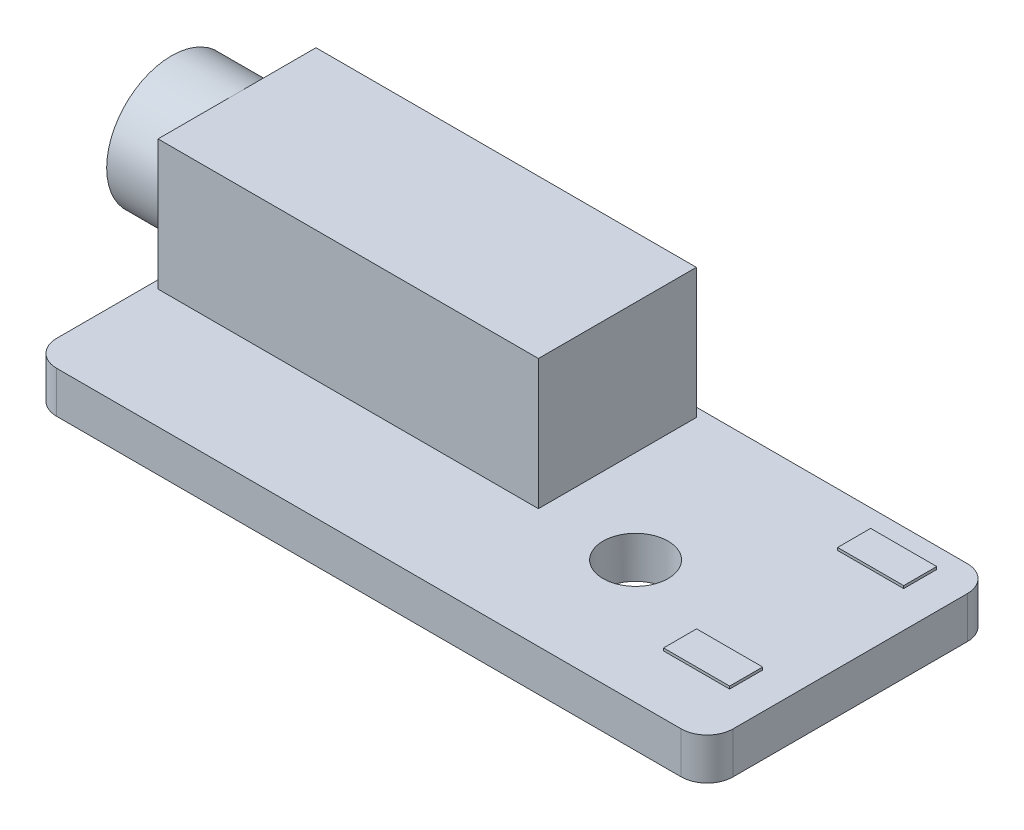
ISO-10303-21;
HEADER;
FILE_DESCRIPTION(('STEP AP214'),'2;1');
FILE_NAME('part.step','',(''),(''),'','','');
FILE_SCHEMA(('AUTOMOTIVE_DESIGN { 1 0 10303 214 1 1 1 1 }'));
ENDSEC;
DATA;
#1=APPLICATION_CONTEXT('core data for automotive mechanical design processes');
#2=APPLICATION_PROTOCOL_DEFINITION('international standard','automotive_design',2000,#1);
#3=PRODUCT_CONTEXT('',#1,'mechanical');
#4=PRODUCT('Part','Part','',(#3));
#5=PRODUCT_RELATED_PRODUCT_CATEGORY('part','',(#4));
#6=PRODUCT_DEFINITION_FORMATION('','',#4);
#7=PRODUCT_DEFINITION_CONTEXT('part definition',#1,'design');
#8=PRODUCT_DEFINITION('design','',#6,#7);
#9=PRODUCT_DEFINITION_SHAPE('','',#8);
#10=(LENGTH_UNIT() NAMED_UNIT(*) SI_UNIT(.MILLI.,.METRE.));
#11=(NAMED_UNIT(*) PLANE_ANGLE_UNIT() SI_UNIT($,.RADIAN.));
#12=(NAMED_UNIT(*) SI_UNIT($,.STERADIAN.) SOLID_ANGLE_UNIT());
#13=UNCERTAINTY_MEASURE_WITH_UNIT(LENGTH_MEASURE(1.E-05),#10,'distance_accuracy_value','');
#14=(GEOMETRIC_REPRESENTATION_CONTEXT(3) GLOBAL_UNCERTAINTY_ASSIGNED_CONTEXT((#13)) GLOBAL_UNIT_ASSIGNED_CONTEXT((#10,
#11,#12)) REPRESENTATION_CONTEXT('',''));
#15=CARTESIAN_POINT('',(0.,0.,0.));
#16=DIRECTION('',(0.,0.,1.));
#17=DIRECTION('',(1.,0.,0.));
#18=AXIS2_PLACEMENT_3D('',#15,#16,#17);
#19=CARTESIAN_POINT('',(12.,1.6,-4.5));
#20=DIRECTION('',(0.,-1.,0.));
#21=DIRECTION('',(0.,0.,-1.));
#22=AXIS2_PLACEMENT_3D('',#19,#20,#21);
#23=PLANE('',#22);
#24=CARTESIAN_POINT('',(5.5,1.6,0.750000000000002));
#25=DIRECTION('',(0.,-1.,0.));
#26=DIRECTION('',(0.,0.,-1.));
#27=AXIS2_PLACEMENT_3D('',#24,#25,#26);
#28=CIRCLE('',#27,1.25);
#29=CARTESIAN_POINT('',(5.5,1.6,-0.499999999999999));
#30=VERTEX_POINT('',#29);
#31=EDGE_CURVE('E696',#30,#30,#28,.T.);
#32=ORIENTED_EDGE('',*,*,#31,.T.);
#33=EDGE_LOOP('',(#32));
#34=FACE_BOUND('',#33,.T.);
#35=DIRECTION('',(0.,0.,-1.));
#36=VECTOR('',#35,1.);
#37=CARTESIAN_POINT('',(11.61,1.6,1.975));
#38=LINE('',#37,#36);
#39=CARTESIAN_POINT('',(11.61,1.6,3.245));
#40=VERTEX_POINT('',#39);
#41=CARTESIAN_POINT('',(11.61,1.6,1.975));
#42=VERTEX_POINT('',#41);
#43=EDGE_CURVE('E200',#40,#42,#38,.T.);
#44=ORIENTED_EDGE('',*,*,#43,.F.);
#45=DIRECTION('',(1.,0.,0.));
#46=VECTOR('',#45,1.);
#47=CARTESIAN_POINT('',(9.07,1.6,3.245));
#48=LINE('',#47,#46);
#49=CARTESIAN_POINT('',(9.07,1.6,3.245));
#50=VERTEX_POINT('',#49);
#51=EDGE_CURVE('E216',#50,#40,#48,.T.);
#52=ORIENTED_EDGE('',*,*,#51,.F.);
#53=DIRECTION('',(0.,0.,1.));
#54=VECTOR('',#53,1.);
#55=CARTESIAN_POINT('',(9.07,1.6,1.975));
#56=LINE('',#55,#54);
#57=CARTESIAN_POINT('',(9.07,1.6,1.975));
#58=VERTEX_POINT('',#57);
#59=EDGE_CURVE('E229',#58,#50,#56,.T.);
#60=ORIENTED_EDGE('',*,*,#59,.F.);
#61=DIRECTION('',(-1.,0.,0.));
#62=VECTOR('',#61,1.);
#63=CARTESIAN_POINT('',(9.07,1.6,1.975));
#64=LINE('',#63,#62);
#65=EDGE_CURVE('E205',#42,#58,#64,.T.);
#66=ORIENTED_EDGE('',*,*,#65,.F.);
#67=EDGE_LOOP('',(#44,#52,#60,#66));
#68=FACE_BOUND('',#67,.T.);
#69=CARTESIAN_POINT('',(12.,1.6,-4.5));
#70=DIRECTION('',(0.,1.,0.));
#71=DIRECTION('',(0.,0.,-1.));
#72=AXIS2_PLACEMENT_3D('',#69,#70,#71);
#73=CIRCLE('',#72,1.);
#74=CARTESIAN_POINT('',(13.,1.6,-4.49999999999999));
#75=VERTEX_POINT('',#74);
#76=CARTESIAN_POINT('',(12.,1.6,-5.5));
#77=VERTEX_POINT('',#76);
#78=EDGE_CURVE('E297',#75,#77,#73,.T.);
#79=ORIENTED_EDGE('',*,*,#78,.T.);
#80=DIRECTION('',(-1.,0.,0.));
#81=VECTOR('',#80,1.);
#82=CARTESIAN_POINT('',(12.,1.6,-5.5));
#83=LINE('',#82,#81);
#84=CARTESIAN_POINT('',(-12.,1.6,-5.5));
#85=VERTEX_POINT('',#84);
#86=EDGE_CURVE('E301',#77,#85,#83,.T.);
#87=ORIENTED_EDGE('',*,*,#86,.T.);
#88=CARTESIAN_POINT('',(-12.,1.6,-4.5));
#89=DIRECTION('',(0.,1.,0.));
#90=DIRECTION('',(0.,0.,1.));
#91=AXIS2_PLACEMENT_3D('',#88,#89,#90);
#92=CIRCLE('',#91,1.);
#93=CARTESIAN_POINT('',(-13.,1.6,-4.49999999999999));
#94=VERTEX_POINT('',#93);
#95=EDGE_CURVE('E305',#85,#94,#92,.T.);
#96=ORIENTED_EDGE('',*,*,#95,.T.);
#97=DIRECTION('',(0.,0.,1.));
#98=VECTOR('',#97,1.);
#99=CARTESIAN_POINT('',(-13.,1.6,-4.49999999999999));
#100=LINE('',#99,#98);
#101=CARTESIAN_POINT('',(-13.,1.6,4.49999999999999));
#102=VERTEX_POINT('',#101);
#103=EDGE_CURVE('E308',#94,#102,#100,.T.);
#104=ORIENTED_EDGE('',*,*,#103,.T.);
#105=CARTESIAN_POINT('',(-12.,1.6,4.5));
#106=DIRECTION('',(0.,1.,0.));
#107=DIRECTION('',(0.,0.,-1.));
#108=AXIS2_PLACEMENT_3D('',#105,#106,#107);
#109=CIRCLE('',#108,1.);
#110=CARTESIAN_POINT('',(-12.,1.6,5.5));
#111=VERTEX_POINT('',#110);
#112=EDGE_CURVE('E311',#102,#111,#109,.T.);
#113=ORIENTED_EDGE('',*,*,#112,.T.);
#114=DIRECTION('',(1.,0.,0.));
#115=VECTOR('',#114,1.);
#116=CARTESIAN_POINT('',(12.,1.6,5.5));
#117=LINE('',#116,#115);
#118=CARTESIAN_POINT('',(12.,1.6,5.5));
#119=VERTEX_POINT('',#118);
#120=EDGE_CURVE('E314',#111,#119,#117,.T.);
#121=ORIENTED_EDGE('',*,*,#120,.T.);
#122=CARTESIAN_POINT('',(12.,1.6,4.5));
#123=DIRECTION('',(0.,1.,0.));
#124=DIRECTION('',(0.,0.,-1.));
#125=AXIS2_PLACEMENT_3D('',#122,#123,#124);
#126=CIRCLE('',#125,1.);
#127=CARTESIAN_POINT('',(13.,1.6,4.49999999999999));
#128=VERTEX_POINT('',#127);
#129=EDGE_CURVE('E317',#119,#128,#126,.T.);
#130=ORIENTED_EDGE('',*,*,#129,.T.);
#131=DIRECTION('',(0.,0.,-1.));
#132=VECTOR('',#131,1.);
#133=CARTESIAN_POINT('',(13.,1.6,-4.49999999999999));
#134=LINE('',#133,#132);
#135=EDGE_CURVE('E320',#128,#75,#134,.T.);
#136=ORIENTED_EDGE('',*,*,#135,.T.);
#137=EDGE_LOOP('',(#79,#87,#96,#104,#113,#121,#130,#136));
#138=FACE_BOUND('',#137,.T.);
#139=DIRECTION('',(0.,0.,-1.));
#140=VECTOR('',#139,1.);
#141=CARTESIAN_POINT('',(11.61,1.6,-4.715));
#142=LINE('',#141,#140);
#143=CARTESIAN_POINT('',(11.61,1.6,-3.445));
#144=VERTEX_POINT('',#143);
#145=CARTESIAN_POINT('',(11.61,1.6,-4.715));
#146=VERTEX_POINT('',#145);
#147=EDGE_CURVE('E251',#144,#146,#142,.T.);
#148=ORIENTED_EDGE('',*,*,#147,.F.);
#149=DIRECTION('',(1.,0.,0.));
#150=VECTOR('',#149,1.);
#151=CARTESIAN_POINT('',(9.07,1.6,-3.445));
#152=LINE('',#151,#150);
#153=CARTESIAN_POINT('',(9.07,1.6,-3.445));
#154=VERTEX_POINT('',#153);
#155=EDGE_CURVE('E257',#154,#144,#152,.T.);
#156=ORIENTED_EDGE('',*,*,#155,.F.);
#157=DIRECTION('',(0.,0.,1.));
#158=VECTOR('',#157,1.);
#159=CARTESIAN_POINT('',(9.07,1.6,-4.715));
#160=LINE('',#159,#158);
#161=CARTESIAN_POINT('',(9.07,1.6,-4.715));
#162=VERTEX_POINT('',#161);
#163=EDGE_CURVE('E274',#162,#154,#160,.T.);
#164=ORIENTED_EDGE('',*,*,#163,.F.);
#165=DIRECTION('',(-1.,0.,0.));
#166=VECTOR('',#165,1.);
#167=CARTESIAN_POINT('',(9.07,1.6,-4.715));
#168=LINE('',#167,#166);
#169=EDGE_CURVE('E270',#146,#162,#168,.T.);
#170=ORIENTED_EDGE('',*,*,#169,.F.);
#171=EDGE_LOOP('',(#148,#156,#164,#170));
#172=FACE_BOUND('',#171,.T.);
#173=DIRECTION('',(0.,0.,-1.));
#174=VECTOR('',#173,1.);
#175=CARTESIAN_POINT('',(1.93,1.6,-5.155));
#176=LINE('',#175,#174);
#177=CARTESIAN_POINT('',(1.93,1.6,0.915000000000001));
#178=VERTEX_POINT('',#177);
#179=CARTESIAN_POINT('',(1.93,1.6,-5.155));
#180=VERTEX_POINT('',#179);
#181=EDGE_CURVE('E198',#178,#180,#176,.T.);
#182=ORIENTED_EDGE('',*,*,#181,.F.);
#183=DIRECTION('',(1.,0.,0.));
#184=VECTOR('',#183,1.);
#185=CARTESIAN_POINT('',(-12.69,1.6,0.915000000000001));
#186=LINE('',#185,#184);
#187=CARTESIAN_POINT('',(-12.69,1.6,0.915000000000001));
#188=VERTEX_POINT('',#187);
#189=EDGE_CURVE('E195',#188,#178,#186,.T.);
#190=ORIENTED_EDGE('',*,*,#189,.F.);
#191=DIRECTION('',(0.,0.,1.));
#192=VECTOR('',#191,1.);
#193=CARTESIAN_POINT('',(-12.69,1.6,-5.155));
#194=LINE('',#193,#192);
#195=CARTESIAN_POINT('',(-12.69,1.6,-5.155));
#196=VERTEX_POINT('',#195);
#197=EDGE_CURVE('E59',#196,#188,#194,.T.);
#198=ORIENTED_EDGE('',*,*,#197,.F.);
#199=DIRECTION('',(-1.,0.,0.));
#200=VECTOR('',#199,1.);
#201=CARTESIAN_POINT('',(-12.69,1.6,-5.155));
#202=LINE('',#201,#200);
#203=EDGE_CURVE('E54',#180,#196,#202,.T.);
#204=ORIENTED_EDGE('',*,*,#203,.F.);
#205=EDGE_LOOP('',(#182,#190,#198,#204));
#206=FACE_BOUND('',#205,.T.);
#207=ADVANCED_FACE('F38',(#34,#68,#138,#172,#206),#23,.F.);
#208=CARTESIAN_POINT('',(12.,1.6,-4.5));
#209=DIRECTION('',(0.,-1.,0.));
#210=DIRECTION('',(0.,0.,-1.));
#211=AXIS2_PLACEMENT_3D('',#208,#209,#210);
#212=CYLINDRICAL_SURFACE('',#211,1.);
#213=CARTESIAN_POINT('',(12.,0.,-4.5));
#214=DIRECTION('',(0.,1.,0.));
#215=DIRECTION('',(0.,0.,-1.));
#216=AXIS2_PLACEMENT_3D('',#213,#214,#215);
#217=CIRCLE('',#216,1.);
#218=CARTESIAN_POINT('',(13.,0.,-4.49999999999999));
#219=VERTEX_POINT('',#218);
#220=CARTESIAN_POINT('',(12.,0.,-5.5));
#221=VERTEX_POINT('',#220);
#222=EDGE_CURVE('E296',#219,#221,#217,.T.);
#223=ORIENTED_EDGE('',*,*,#222,.T.);
#224=DIRECTION('',(0.,-1.,0.));
#225=VECTOR('',#224,1.);
#226=CARTESIAN_POINT('',(12.,1.6,-5.5));
#227=LINE('',#226,#225);
#228=EDGE_CURVE('E47',#77,#221,#227,.T.);
#229=ORIENTED_EDGE('',*,*,#228,.F.);
#230=ORIENTED_EDGE('',*,*,#78,.F.);
#231=DIRECTION('',(0.,-1.,0.));
#232=VECTOR('',#231,1.);
#233=CARTESIAN_POINT('',(13.,1.6,-4.49999999999999));
#234=LINE('',#233,#232);
#235=EDGE_CURVE('E323',#75,#219,#234,.T.);
#236=ORIENTED_EDGE('',*,*,#235,.T.);
#237=EDGE_LOOP('',(#223,#229,#230,#236));
#238=FACE_BOUND('',#237,.T.);
#239=ADVANCED_FACE('F40',(#238),#212,.T.);
#240=CARTESIAN_POINT('',(12.,1.6,-5.5));
#241=DIRECTION('',(0.,0.,1.));
#242=DIRECTION('',(1.,0.,0.));
#243=AXIS2_PLACEMENT_3D('',#240,#241,#242);
#244=PLANE('',#243);
#245=DIRECTION('',(-1.,0.,0.));
#246=VECTOR('',#245,1.);
#247=CARTESIAN_POINT('',(12.,0.,-5.5));
#248=LINE('',#247,#246);
#249=CARTESIAN_POINT('',(-12.,0.,-5.5));
#250=VERTEX_POINT('',#249);
#251=EDGE_CURVE('E327',#221,#250,#248,.T.);
#252=ORIENTED_EDGE('',*,*,#251,.T.);
#253=DIRECTION('',(0.,-1.,0.));
#254=VECTOR('',#253,1.);
#255=CARTESIAN_POINT('',(-12.,1.6,-5.5));
#256=LINE('',#255,#254);
#257=EDGE_CURVE('E370',#85,#250,#256,.T.);
#258=ORIENTED_EDGE('',*,*,#257,.F.);
#259=ORIENTED_EDGE('',*,*,#86,.F.);
#260=ORIENTED_EDGE('',*,*,#228,.T.);
#261=EDGE_LOOP('',(#252,#258,#259,#260));
#262=FACE_BOUND('',#261,.T.);
#263=ADVANCED_FACE('F377',(#262),#244,.F.);
#264=CARTESIAN_POINT('',(-12.,1.6,-4.5));
#265=DIRECTION('',(0.,-1.,0.));
#266=DIRECTION('',(0.,0.,-1.));
#267=AXIS2_PLACEMENT_3D('',#264,#265,#266);
#268=CYLINDRICAL_SURFACE('',#267,1.);
#269=CARTESIAN_POINT('',(-12.,0.,-4.5));
#270=DIRECTION('',(0.,1.,0.));
#271=DIRECTION('',(0.,0.,1.));
#272=AXIS2_PLACEMENT_3D('',#269,#270,#271);
#273=CIRCLE('',#272,1.);
#274=CARTESIAN_POINT('',(-13.,0.,-4.49999999999999));
#275=VERTEX_POINT('',#274);
#276=EDGE_CURVE('E330',#250,#275,#273,.T.);
#277=ORIENTED_EDGE('',*,*,#276,.T.);
#278=DIRECTION('',(0.,-1.,0.));
#279=VECTOR('',#278,1.);
#280=CARTESIAN_POINT('',(-13.,1.6,-4.49999999999999));
#281=LINE('',#280,#279);
#282=EDGE_CURVE('E366',#94,#275,#281,.T.);
#283=ORIENTED_EDGE('',*,*,#282,.F.);
#284=ORIENTED_EDGE('',*,*,#95,.F.);
#285=ORIENTED_EDGE('',*,*,#257,.T.);
#286=EDGE_LOOP('',(#277,#283,#284,#285));
#287=FACE_BOUND('',#286,.T.);
#288=ADVANCED_FACE('F392',(#287),#268,.T.);
#289=CARTESIAN_POINT('',(-13.,1.6,-4.49999999999999));
#290=DIRECTION('',(1.,0.,0.));
#291=DIRECTION('',(0.,0.,-1.));
#292=AXIS2_PLACEMENT_3D('',#289,#290,#291);
#293=PLANE('',#292);
#294=DIRECTION('',(0.,0.,1.));
#295=VECTOR('',#294,1.);
#296=CARTESIAN_POINT('',(-13.,0.,-4.49999999999999));
#297=LINE('',#296,#295);
#298=CARTESIAN_POINT('',(-13.,0.,4.49999999999999));
#299=VERTEX_POINT('',#298);
#300=EDGE_CURVE('E333',#275,#299,#297,.T.);
#301=ORIENTED_EDGE('',*,*,#300,.T.);
#302=DIRECTION('',(0.,-1.,0.));
#303=VECTOR('',#302,1.);
#304=CARTESIAN_POINT('',(-13.,1.6,4.49999999999999));
#305=LINE('',#304,#303);
#306=EDGE_CURVE('E362',#102,#299,#305,.T.);
#307=ORIENTED_EDGE('',*,*,#306,.F.);
#308=ORIENTED_EDGE('',*,*,#103,.F.);
#309=ORIENTED_EDGE('',*,*,#282,.T.);
#310=EDGE_LOOP('',(#301,#307,#308,#309));
#311=FACE_BOUND('',#310,.T.);
#312=ADVANCED_FACE('F396',(#311),#293,.F.);
#313=CARTESIAN_POINT('',(-12.,1.6,4.5));
#314=DIRECTION('',(0.,-1.,0.));
#315=DIRECTION('',(0.,0.,-1.));
#316=AXIS2_PLACEMENT_3D('',#313,#314,#315);
#317=CYLINDRICAL_SURFACE('',#316,1.);
#318=CARTESIAN_POINT('',(-12.,0.,4.5));
#319=DIRECTION('',(0.,1.,0.));
#320=DIRECTION('',(0.,0.,-1.));
#321=AXIS2_PLACEMENT_3D('',#318,#319,#320);
#322=CIRCLE('',#321,1.);
#323=CARTESIAN_POINT('',(-12.,0.,5.5));
#324=VERTEX_POINT('',#323);
#325=EDGE_CURVE('E336',#299,#324,#322,.T.);
#326=ORIENTED_EDGE('',*,*,#325,.T.);
#327=DIRECTION('',(0.,-1.,0.));
#328=VECTOR('',#327,1.);
#329=CARTESIAN_POINT('',(-12.,1.6,5.5));
#330=LINE('',#329,#328);
#331=EDGE_CURVE('E358',#111,#324,#330,.T.);
#332=ORIENTED_EDGE('',*,*,#331,.F.);
#333=ORIENTED_EDGE('',*,*,#112,.F.);
#334=ORIENTED_EDGE('',*,*,#306,.T.);
#335=EDGE_LOOP('',(#326,#332,#333,#334));
#336=FACE_BOUND('',#335,.T.);
#337=ADVANCED_FACE('F415',(#336),#317,.T.);
#338=CARTESIAN_POINT('',(12.,1.6,5.5));
#339=DIRECTION('',(0.,0.,-1.));
#340=DIRECTION('',(-1.,0.,0.));
#341=AXIS2_PLACEMENT_3D('',#338,#339,#340);
#342=PLANE('',#341);
#343=DIRECTION('',(1.,0.,0.));
#344=VECTOR('',#343,1.);
#345=CARTESIAN_POINT('',(12.,0.,5.5));
#346=LINE('',#345,#344);
#347=CARTESIAN_POINT('',(12.,0.,5.5));
#348=VERTEX_POINT('',#347);
#349=EDGE_CURVE('E339',#324,#348,#346,.T.);
#350=ORIENTED_EDGE('',*,*,#349,.T.);
#351=DIRECTION('',(0.,-1.,0.));
#352=VECTOR('',#351,1.);
#353=CARTESIAN_POINT('',(12.,1.6,5.5));
#354=LINE('',#353,#352);
#355=EDGE_CURVE('E354',#119,#348,#354,.T.);
#356=ORIENTED_EDGE('',*,*,#355,.F.);
#357=ORIENTED_EDGE('',*,*,#120,.F.);
#358=ORIENTED_EDGE('',*,*,#331,.T.);
#359=EDGE_LOOP('',(#350,#356,#357,#358));
#360=FACE_BOUND('',#359,.T.);
#361=ADVANCED_FACE('F412',(#360),#342,.F.);
#362=CARTESIAN_POINT('',(12.,1.6,4.5));
#363=DIRECTION('',(0.,-1.,0.));
#364=DIRECTION('',(0.,0.,-1.));
#365=AXIS2_PLACEMENT_3D('',#362,#363,#364);
#366=CYLINDRICAL_SURFACE('',#365,1.);
#367=CARTESIAN_POINT('',(12.,0.,4.5));
#368=DIRECTION('',(0.,1.,0.));
#369=DIRECTION('',(0.,0.,-1.));
#370=AXIS2_PLACEMENT_3D('',#367,#368,#369);
#371=CIRCLE('',#370,1.);
#372=CARTESIAN_POINT('',(13.,0.,4.49999999999999));
#373=VERTEX_POINT('',#372);
#374=EDGE_CURVE('E342',#348,#373,#371,.T.);
#375=ORIENTED_EDGE('',*,*,#374,.T.);
#376=DIRECTION('',(0.,-1.,0.));
#377=VECTOR('',#376,1.);
#378=CARTESIAN_POINT('',(13.,1.6,4.49999999999999));
#379=LINE('',#378,#377);
#380=EDGE_CURVE('E350',#128,#373,#379,.T.);
#381=ORIENTED_EDGE('',*,*,#380,.F.);
#382=ORIENTED_EDGE('',*,*,#129,.F.);
#383=ORIENTED_EDGE('',*,*,#355,.T.);
#384=EDGE_LOOP('',(#375,#381,#382,#383));
#385=FACE_BOUND('',#384,.T.);
#386=ADVANCED_FACE('F408',(#385),#366,.T.);
#387=CARTESIAN_POINT('',(13.,1.6,-4.49999999999999));
#388=DIRECTION('',(-1.,0.,0.));
#389=DIRECTION('',(0.,0.,1.));
#390=AXIS2_PLACEMENT_3D('',#387,#388,#389);
#391=PLANE('',#390);
#392=DIRECTION('',(0.,0.,-1.));
#393=VECTOR('',#392,1.);
#394=CARTESIAN_POINT('',(13.,0.,-4.49999999999999));
#395=LINE('',#394,#393);
#396=EDGE_CURVE('E302',#373,#219,#395,.T.);
#397=ORIENTED_EDGE('',*,*,#396,.T.);
#398=ORIENTED_EDGE('',*,*,#235,.F.);
#399=ORIENTED_EDGE('',*,*,#135,.F.);
#400=ORIENTED_EDGE('',*,*,#380,.T.);
#401=EDGE_LOOP('',(#397,#398,#399,#400));
#402=FACE_BOUND('',#401,.T.);
#403=ADVANCED_FACE('F406',(#402),#391,.F.);
#404=CARTESIAN_POINT('',(12.,0.,-4.5));
#405=DIRECTION('',(0.,-1.,0.));
#406=DIRECTION('',(0.,0.,-1.));
#407=AXIS2_PLACEMENT_3D('',#404,#405,#406);
#408=PLANE('',#407);
#409=CARTESIAN_POINT('',(5.5,0.,0.750000000000002));
#410=DIRECTION('',(0.,1.,0.));
#411=DIRECTION('',(0.,0.,1.));
#412=AXIS2_PLACEMENT_3D('',#409,#410,#411);
#413=CIRCLE('',#412,1.25);
#414=CARTESIAN_POINT('',(5.5,0.,2.));
#415=VERTEX_POINT('',#414);
#416=EDGE_CURVE('E694',#415,#415,#413,.T.);
#417=ORIENTED_EDGE('',*,*,#416,.T.);
#418=EDGE_LOOP('',(#417));
#419=FACE_BOUND('',#418,.T.);
#420=ORIENTED_EDGE('',*,*,#222,.F.);
#421=ORIENTED_EDGE('',*,*,#396,.F.);
#422=ORIENTED_EDGE('',*,*,#374,.F.);
#423=ORIENTED_EDGE('',*,*,#349,.F.);
#424=ORIENTED_EDGE('',*,*,#325,.F.);
#425=ORIENTED_EDGE('',*,*,#300,.F.);
#426=ORIENTED_EDGE('',*,*,#276,.F.);
#427=ORIENTED_EDGE('',*,*,#251,.F.);
#428=EDGE_LOOP('',(#420,#421,#422,#423,#424,#425,#426,#427));
#429=FACE_BOUND('',#428,.T.);
#430=ADVANCED_FACE('F385',(#419,#429),#408,.T.);
#431=CARTESIAN_POINT('',(11.61,1.7,-4.715));
#432=DIRECTION('',(-1.,0.,0.));
#433=DIRECTION('',(0.,0.,1.));
#434=AXIS2_PLACEMENT_3D('',#431,#432,#433);
#435=PLANE('',#434);
#436=ORIENTED_EDGE('',*,*,#147,.T.);
#437=DIRECTION('',(0.,-1.,0.));
#438=VECTOR('',#437,1.);
#439=CARTESIAN_POINT('',(11.61,1.7,-4.715));
#440=LINE('',#439,#438);
#441=CARTESIAN_POINT('',(11.61,1.7,-4.715));
#442=VERTEX_POINT('',#441);
#443=EDGE_CURVE('E292',#442,#146,#440,.T.);
#444=ORIENTED_EDGE('',*,*,#443,.F.);
#445=DIRECTION('',(0.,0.,-1.));
#446=VECTOR('',#445,1.);
#447=CARTESIAN_POINT('',(11.61,1.7,-4.715));
#448=LINE('',#447,#446);
#449=CARTESIAN_POINT('',(11.61,1.7,-3.445));
#450=VERTEX_POINT('',#449);
#451=EDGE_CURVE('E252',#450,#442,#448,.T.);
#452=ORIENTED_EDGE('',*,*,#451,.F.);
#453=DIRECTION('',(0.,-1.,0.));
#454=VECTOR('',#453,1.);
#455=CARTESIAN_POINT('',(11.61,1.7,-3.445));
#456=LINE('',#455,#454);
#457=EDGE_CURVE('E266',#450,#144,#456,.T.);
#458=ORIENTED_EDGE('',*,*,#457,.T.);
#459=EDGE_LOOP('',(#436,#444,#452,#458));
#460=FACE_BOUND('',#459,.T.);
#461=ADVANCED_FACE('F436',(#460),#435,.F.);
#462=CARTESIAN_POINT('',(9.07,1.7,-4.715));
#463=DIRECTION('',(0.,0.,1.));
#464=DIRECTION('',(1.,0.,0.));
#465=AXIS2_PLACEMENT_3D('',#462,#463,#464);
#466=PLANE('',#465);
#467=ORIENTED_EDGE('',*,*,#169,.T.);
#468=DIRECTION('',(0.,-1.,0.));
#469=VECTOR('',#468,1.);
#470=CARTESIAN_POINT('',(9.07,1.7,-4.715));
#471=LINE('',#470,#469);
#472=CARTESIAN_POINT('',(9.07,1.7,-4.715));
#473=VERTEX_POINT('',#472);
#474=EDGE_CURVE('E288',#473,#162,#471,.T.);
#475=ORIENTED_EDGE('',*,*,#474,.F.);
#476=DIRECTION('',(-1.,0.,0.));
#477=VECTOR('',#476,1.);
#478=CARTESIAN_POINT('',(9.07,1.7,-4.715));
#479=LINE('',#478,#477);
#480=EDGE_CURVE('E256',#442,#473,#479,.T.);
#481=ORIENTED_EDGE('',*,*,#480,.F.);
#482=ORIENTED_EDGE('',*,*,#443,.T.);
#483=EDGE_LOOP('',(#467,#475,#481,#482));
#484=FACE_BOUND('',#483,.T.);
#485=ADVANCED_FACE('F465',(#484),#466,.F.);
#486=CARTESIAN_POINT('',(9.07,1.7,-4.715));
#487=DIRECTION('',(1.,0.,0.));
#488=DIRECTION('',(0.,0.,-1.));
#489=AXIS2_PLACEMENT_3D('',#486,#487,#488);
#490=PLANE('',#489);
#491=ORIENTED_EDGE('',*,*,#163,.T.);
#492=DIRECTION('',(0.,-1.,0.));
#493=VECTOR('',#492,1.);
#494=CARTESIAN_POINT('',(9.07,1.7,-3.445));
#495=LINE('',#494,#493);
#496=CARTESIAN_POINT('',(9.07,1.7,-3.445));
#497=VERTEX_POINT('',#496);
#498=EDGE_CURVE('E284',#497,#154,#495,.T.);
#499=ORIENTED_EDGE('',*,*,#498,.F.);
#500=DIRECTION('',(0.,0.,1.));
#501=VECTOR('',#500,1.);
#502=CARTESIAN_POINT('',(9.07,1.7,-4.715));
#503=LINE('',#502,#501);
#504=EDGE_CURVE('E260',#473,#497,#503,.T.);
#505=ORIENTED_EDGE('',*,*,#504,.F.);
#506=ORIENTED_EDGE('',*,*,#474,.T.);
#507=EDGE_LOOP('',(#491,#499,#505,#506));
#508=FACE_BOUND('',#507,.T.);
#509=ADVANCED_FACE('F471',(#508),#490,.F.);
#510=CARTESIAN_POINT('',(9.07,1.7,-3.445));
#511=DIRECTION('',(0.,0.,-1.));
#512=DIRECTION('',(-1.,0.,0.));
#513=AXIS2_PLACEMENT_3D('',#510,#511,#512);
#514=PLANE('',#513);
#515=ORIENTED_EDGE('',*,*,#155,.T.);
#516=ORIENTED_EDGE('',*,*,#457,.F.);
#517=DIRECTION('',(1.,0.,0.));
#518=VECTOR('',#517,1.);
#519=CARTESIAN_POINT('',(9.07,1.7,-3.445));
#520=LINE('',#519,#518);
#521=EDGE_CURVE('E263',#497,#450,#520,.T.);
#522=ORIENTED_EDGE('',*,*,#521,.F.);
#523=ORIENTED_EDGE('',*,*,#498,.T.);
#524=EDGE_LOOP('',(#515,#516,#522,#523));
#525=FACE_BOUND('',#524,.T.);
#526=ADVANCED_FACE('F478',(#525),#514,.F.);
#527=CARTESIAN_POINT('',(0.,1.7,0.));
#528=DIRECTION('',(0.,1.,0.));
#529=DIRECTION('',(0.,0.,1.));
#530=AXIS2_PLACEMENT_3D('',#527,#528,#529);
#531=PLANE('',#530);
#532=ORIENTED_EDGE('',*,*,#451,.T.);
#533=ORIENTED_EDGE('',*,*,#480,.T.);
#534=ORIENTED_EDGE('',*,*,#504,.T.);
#535=ORIENTED_EDGE('',*,*,#521,.T.);
#536=EDGE_LOOP('',(#532,#533,#534,#535));
#537=FACE_BOUND('',#536,.T.);
#538=ADVANCED_FACE('F486',(#537),#531,.T.);
#539=CARTESIAN_POINT('',(11.61,1.7,1.975));
#540=DIRECTION('',(-1.,0.,0.));
#541=DIRECTION('',(0.,0.,1.));
#542=AXIS2_PLACEMENT_3D('',#539,#540,#541);
#543=PLANE('',#542);
#544=ORIENTED_EDGE('',*,*,#43,.T.);
#545=DIRECTION('',(0.,-1.,0.));
#546=VECTOR('',#545,1.);
#547=CARTESIAN_POINT('',(11.61,1.7,1.975));
#548=LINE('',#547,#546);
#549=CARTESIAN_POINT('',(11.61,1.7,1.975));
#550=VERTEX_POINT('',#549);
#551=EDGE_CURVE('E247',#550,#42,#548,.T.);
#552=ORIENTED_EDGE('',*,*,#551,.F.);
#553=DIRECTION('',(0.,0.,-1.));
#554=VECTOR('',#553,1.);
#555=CARTESIAN_POINT('',(11.61,1.7,1.975));
#556=LINE('',#555,#554);
#557=CARTESIAN_POINT('',(11.61,1.7,3.245));
#558=VERTEX_POINT('',#557);
#559=EDGE_CURVE('E211',#558,#550,#556,.T.);
#560=ORIENTED_EDGE('',*,*,#559,.F.);
#561=DIRECTION('',(0.,-1.,0.));
#562=VECTOR('',#561,1.);
#563=CARTESIAN_POINT('',(11.61,1.7,3.245));
#564=LINE('',#563,#562);
#565=EDGE_CURVE('E224',#558,#40,#564,.T.);
#566=ORIENTED_EDGE('',*,*,#565,.T.);
#567=EDGE_LOOP('',(#544,#552,#560,#566));
#568=FACE_BOUND('',#567,.T.);
#569=ADVANCED_FACE('F494',(#568),#543,.F.);
#570=CARTESIAN_POINT('',(9.07,1.7,1.975));
#571=DIRECTION('',(0.,0.,1.));
#572=DIRECTION('',(1.,0.,0.));
#573=AXIS2_PLACEMENT_3D('',#570,#571,#572);
#574=PLANE('',#573);
#575=ORIENTED_EDGE('',*,*,#65,.T.);
#576=DIRECTION('',(0.,-1.,0.));
#577=VECTOR('',#576,1.);
#578=CARTESIAN_POINT('',(9.07,1.7,1.975));
#579=LINE('',#578,#577);
#580=CARTESIAN_POINT('',(9.07,1.7,1.975));
#581=VERTEX_POINT('',#580);
#582=EDGE_CURVE('E243',#581,#58,#579,.T.);
#583=ORIENTED_EDGE('',*,*,#582,.F.);
#584=DIRECTION('',(-1.,0.,0.));
#585=VECTOR('',#584,1.);
#586=CARTESIAN_POINT('',(9.07,1.7,1.975));
#587=LINE('',#586,#585);
#588=EDGE_CURVE('E215',#550,#581,#587,.T.);
#589=ORIENTED_EDGE('',*,*,#588,.F.);
#590=ORIENTED_EDGE('',*,*,#551,.T.);
#591=EDGE_LOOP('',(#575,#583,#589,#590));
#592=FACE_BOUND('',#591,.T.);
#593=ADVANCED_FACE('F502',(#592),#574,.F.);
#594=CARTESIAN_POINT('',(9.07,1.7,1.975));
#595=DIRECTION('',(1.,0.,0.));
#596=DIRECTION('',(0.,0.,-1.));
#597=AXIS2_PLACEMENT_3D('',#594,#595,#596);
#598=PLANE('',#597);
#599=ORIENTED_EDGE('',*,*,#59,.T.);
#600=DIRECTION('',(0.,-1.,0.));
#601=VECTOR('',#600,1.);
#602=CARTESIAN_POINT('',(9.07,1.7,3.245));
#603=LINE('',#602,#601);
#604=CARTESIAN_POINT('',(9.07,1.7,3.245));
#605=VERTEX_POINT('',#604);
#606=EDGE_CURVE('E239',#605,#50,#603,.T.);
#607=ORIENTED_EDGE('',*,*,#606,.F.);
#608=DIRECTION('',(0.,0.,1.));
#609=VECTOR('',#608,1.);
#610=CARTESIAN_POINT('',(9.07,1.7,1.975));
#611=LINE('',#610,#609);
#612=EDGE_CURVE('E219',#581,#605,#611,.T.);
#613=ORIENTED_EDGE('',*,*,#612,.F.);
#614=ORIENTED_EDGE('',*,*,#582,.T.);
#615=EDGE_LOOP('',(#599,#607,#613,#614));
#616=FACE_BOUND('',#615,.T.);
#617=ADVANCED_FACE('F510',(#616),#598,.F.);
#618=CARTESIAN_POINT('',(9.07,1.7,3.245));
#619=DIRECTION('',(0.,0.,-1.));
#620=DIRECTION('',(-1.,0.,0.));
#621=AXIS2_PLACEMENT_3D('',#618,#619,#620);
#622=PLANE('',#621);
#623=ORIENTED_EDGE('',*,*,#51,.T.);
#624=ORIENTED_EDGE('',*,*,#565,.F.);
#625=DIRECTION('',(1.,0.,0.));
#626=VECTOR('',#625,1.);
#627=CARTESIAN_POINT('',(9.07,1.7,3.245));
#628=LINE('',#627,#626);
#629=EDGE_CURVE('E222',#605,#558,#628,.T.);
#630=ORIENTED_EDGE('',*,*,#629,.F.);
#631=ORIENTED_EDGE('',*,*,#606,.T.);
#632=EDGE_LOOP('',(#623,#624,#630,#631));
#633=FACE_BOUND('',#632,.T.);
#634=ADVANCED_FACE('F518',(#633),#622,.F.);
#635=CARTESIAN_POINT('',(0.,1.7,0.));
#636=DIRECTION('',(0.,1.,0.));
#637=DIRECTION('',(0.,0.,1.));
#638=AXIS2_PLACEMENT_3D('',#635,#636,#637);
#639=PLANE('',#638);
#640=ORIENTED_EDGE('',*,*,#559,.T.);
#641=ORIENTED_EDGE('',*,*,#588,.T.);
#642=ORIENTED_EDGE('',*,*,#612,.T.);
#643=ORIENTED_EDGE('',*,*,#629,.T.);
#644=EDGE_LOOP('',(#640,#641,#642,#643));
#645=FACE_BOUND('',#644,.T.);
#646=ADVANCED_FACE('F526',(#645),#639,.T.);
#647=CARTESIAN_POINT('',(1.93,6.6,-5.155));
#648=DIRECTION('',(-1.,0.,0.));
#649=DIRECTION('',(0.,0.,1.));
#650=AXIS2_PLACEMENT_3D('',#647,#648,#649);
#651=PLANE('',#650);
#652=ORIENTED_EDGE('',*,*,#181,.T.);
#653=DIRECTION('',(0.,-1.,0.));
#654=VECTOR('',#653,1.);
#655=CARTESIAN_POINT('',(1.93,6.6,-5.155));
#656=LINE('',#655,#654);
#657=CARTESIAN_POINT('',(1.93,6.6,-5.155));
#658=VERTEX_POINT('',#657);
#659=EDGE_CURVE('E177',#658,#180,#656,.T.);
#660=ORIENTED_EDGE('',*,*,#659,.F.);
#661=DIRECTION('',(0.,0.,-1.));
#662=VECTOR('',#661,1.);
#663=CARTESIAN_POINT('',(1.93,6.6,-5.155));
#664=LINE('',#663,#662);
#665=CARTESIAN_POINT('',(1.93,6.6,0.915000000000001));
#666=VERTEX_POINT('',#665);
#667=EDGE_CURVE('E185',#666,#658,#664,.T.);
#668=ORIENTED_EDGE('',*,*,#667,.F.);
#669=DIRECTION('',(0.,-1.,0.));
#670=VECTOR('',#669,1.);
#671=CARTESIAN_POINT('',(1.93,6.6,0.915000000000001));
#672=LINE('',#671,#670);
#673=EDGE_CURVE('E718',#666,#178,#672,.T.);
#674=ORIENTED_EDGE('',*,*,#673,.T.);
#675=EDGE_LOOP('',(#652,#660,#668,#674));
#676=FACE_BOUND('',#675,.T.);
#677=ADVANCED_FACE('F197',(#676),#651,.F.);
#678=CARTESIAN_POINT('',(-12.69,6.6,-5.155));
#679=DIRECTION('',(0.,0.,1.));
#680=DIRECTION('',(1.,0.,0.));
#681=AXIS2_PLACEMENT_3D('',#678,#679,#680);
#682=PLANE('',#681);
#683=ORIENTED_EDGE('',*,*,#203,.T.);
#684=DIRECTION('',(0.,-1.,0.));
#685=VECTOR('',#684,1.);
#686=CARTESIAN_POINT('',(-12.69,6.6,-5.155));
#687=LINE('',#686,#685);
#688=CARTESIAN_POINT('',(-12.69,6.6,-5.155));
#689=VERTEX_POINT('',#688);
#690=EDGE_CURVE('E180',#689,#196,#687,.T.);
#691=ORIENTED_EDGE('',*,*,#690,.F.);
#692=DIRECTION('',(-1.,0.,0.));
#693=VECTOR('',#692,1.);
#694=CARTESIAN_POINT('',(-12.69,6.6,-5.155));
#695=LINE('',#694,#693);
#696=EDGE_CURVE('E173',#658,#689,#695,.T.);
#697=ORIENTED_EDGE('',*,*,#696,.F.);
#698=ORIENTED_EDGE('',*,*,#659,.T.);
#699=EDGE_LOOP('',(#683,#691,#697,#698));
#700=FACE_BOUND('',#699,.T.);
#701=ADVANCED_FACE('F175',(#700),#682,.F.);
#702=CARTESIAN_POINT('',(-12.69,6.6,-5.155));
#703=DIRECTION('',(1.,0.,0.));
#704=DIRECTION('',(0.,0.,-1.));
#705=AXIS2_PLACEMENT_3D('',#702,#703,#704);
#706=PLANE('',#705);
#707=CARTESIAN_POINT('',(-12.69,4.1,-2.12));
#708=DIRECTION('',(1.,0.,0.));
#709=DIRECTION('',(0.,0.,-1.));
#710=AXIS2_PLACEMENT_3D('',#707,#708,#709);
#711=CIRCLE('',#710,2.49);
#712=CARTESIAN_POINT('',(-12.69,4.1,-4.61));
#713=VERTEX_POINT('',#712);
#714=EDGE_CURVE('E11',#713,#713,#711,.F.);
#715=ORIENTED_EDGE('',*,*,#714,.F.);
#716=EDGE_LOOP('',(#715));
#717=FACE_BOUND('',#716,.T.);
#718=ORIENTED_EDGE('',*,*,#197,.T.);
#719=DIRECTION('',(0.,-1.,0.));
#720=VECTOR('',#719,1.);
#721=CARTESIAN_POINT('',(-12.69,6.6,0.915000000000001));
#722=LINE('',#721,#720);
#723=CARTESIAN_POINT('',(-12.69,6.6,0.915000000000001));
#724=VERTEX_POINT('',#723);
#725=EDGE_CURVE('E207',#724,#188,#722,.T.);
#726=ORIENTED_EDGE('',*,*,#725,.F.);
#727=DIRECTION('',(0.,0.,1.));
#728=VECTOR('',#727,1.);
#729=CARTESIAN_POINT('',(-12.69,6.6,-5.155));
#730=LINE('',#729,#728);
#731=EDGE_CURVE('E184',#689,#724,#730,.T.);
#732=ORIENTED_EDGE('',*,*,#731,.F.);
#733=ORIENTED_EDGE('',*,*,#690,.T.);
#734=EDGE_LOOP('',(#718,#726,#732,#733));
#735=FACE_BOUND('',#734,.T.);
#736=ADVANCED_FACE('F547',(#717,#735),#706,.F.);
#737=CARTESIAN_POINT('',(-12.69,6.6,0.915000000000001));
#738=DIRECTION('',(0.,0.,-1.));
#739=DIRECTION('',(-1.,0.,0.));
#740=AXIS2_PLACEMENT_3D('',#737,#738,#739);
#741=PLANE('',#740);
#742=ORIENTED_EDGE('',*,*,#189,.T.);
#743=ORIENTED_EDGE('',*,*,#673,.F.);
#744=DIRECTION('',(1.,0.,0.));
#745=VECTOR('',#744,1.);
#746=CARTESIAN_POINT('',(-12.69,6.6,0.915000000000001));
#747=LINE('',#746,#745);
#748=EDGE_CURVE('E190',#724,#666,#747,.T.);
#749=ORIENTED_EDGE('',*,*,#748,.F.);
#750=ORIENTED_EDGE('',*,*,#725,.T.);
#751=EDGE_LOOP('',(#742,#743,#749,#750));
#752=FACE_BOUND('',#751,.T.);
#753=ADVANCED_FACE('F555',(#752),#741,.F.);
#754=CARTESIAN_POINT('',(0.,6.6,0.));
#755=DIRECTION('',(0.,1.,0.));
#756=DIRECTION('',(0.,0.,1.));
#757=AXIS2_PLACEMENT_3D('',#754,#755,#756);
#758=PLANE('',#757);
#759=ORIENTED_EDGE('',*,*,#667,.T.);
#760=ORIENTED_EDGE('',*,*,#696,.T.);
#761=ORIENTED_EDGE('',*,*,#731,.T.);
#762=ORIENTED_EDGE('',*,*,#748,.T.);
#763=EDGE_LOOP('',(#759,#760,#761,#762));
#764=FACE_BOUND('',#763,.T.);
#765=ADVANCED_FACE('F188',(#764),#758,.T.);
#766=CARTESIAN_POINT('',(-15.21,4.1,-2.12));
#767=DIRECTION('',(-1.,0.,0.));
#768=DIRECTION('',(0.,0.,1.));
#769=AXIS2_PLACEMENT_3D('',#766,#767,#768);
#770=PLANE('',#769);
#771=CARTESIAN_POINT('',(-15.21,4.1,-2.12));
#772=DIRECTION('',(-1.,0.,0.));
#773=DIRECTION('',(0.,0.,1.));
#774=AXIS2_PLACEMENT_3D('',#771,#772,#773);
#775=CIRCLE('',#774,2.49);
#776=CARTESIAN_POINT('',(-15.21,4.1,0.37));
#777=VERTEX_POINT('',#776);
#778=EDGE_CURVE('E709',#777,#777,#775,.T.);
#779=ORIENTED_EDGE('',*,*,#778,.T.);
#780=EDGE_LOOP('',(#779));
#781=FACE_BOUND('',#780,.T.);
#782=CARTESIAN_POINT('',(-15.21,4.1,-2.12));
#783=DIRECTION('',(-1.,0.,0.));
#784=DIRECTION('',(0.,0.,1.));
#785=AXIS2_PLACEMENT_3D('',#782,#783,#784);
#786=CIRCLE('',#785,1.795);
#787=CARTESIAN_POINT('',(-15.21,4.1,-0.325));
#788=VERTEX_POINT('',#787);
#789=EDGE_CURVE('E703',#788,#788,#786,.T.);
#790=ORIENTED_EDGE('',*,*,#789,.F.);
#791=EDGE_LOOP('',(#790));
#792=FACE_BOUND('',#791,.T.);
#793=ADVANCED_FACE('F571',(#781,#792),#770,.T.);
#794=CARTESIAN_POINT('',(-15.21,4.1,-2.12));
#795=DIRECTION('',(1.,0.,0.));
#796=DIRECTION('',(0.,0.,-1.));
#797=AXIS2_PLACEMENT_3D('',#794,#795,#796);
#798=CYLINDRICAL_SURFACE('',#797,2.49);
#799=ORIENTED_EDGE('',*,*,#778,.F.);
#800=EDGE_LOOP('',(#799));
#801=FACE_BOUND('',#800,.T.);
#802=ORIENTED_EDGE('',*,*,#714,.T.);
#803=EDGE_LOOP('',(#802));
#804=FACE_BOUND('',#803,.T.);
#805=ADVANCED_FACE('F577',(#801,#804),#798,.T.);
#806=CARTESIAN_POINT('',(-15.21,4.1,-2.12));
#807=DIRECTION('',(1.,0.,0.));
#808=DIRECTION('',(0.,0.,-1.));
#809=AXIS2_PLACEMENT_3D('',#806,#807,#808);
#810=CYLINDRICAL_SURFACE('',#809,1.795);
#811=ORIENTED_EDGE('',*,*,#789,.T.);
#812=EDGE_LOOP('',(#811));
#813=FACE_BOUND('',#812,.T.);
#814=CARTESIAN_POINT('',(-12.69,4.1,-2.12));
#815=DIRECTION('',(-1.,0.,0.));
#816=DIRECTION('',(0.,0.,1.));
#817=AXIS2_PLACEMENT_3D('',#814,#815,#816);
#818=CIRCLE('',#817,1.795);
#819=CARTESIAN_POINT('',(-12.69,4.1,-0.325));
#820=VERTEX_POINT('',#819);
#821=EDGE_CURVE('E698',#820,#820,#818,.T.);
#822=ORIENTED_EDGE('',*,*,#821,.F.);
#823=EDGE_LOOP('',(#822));
#824=FACE_BOUND('',#823,.T.);
#825=ADVANCED_FACE('F585',(#813,#824),#810,.F.);
#826=ORIENTED_EDGE('',*,*,#821,.T.);
#827=EDGE_LOOP('',(#826));
#828=FACE_BOUND('',#827,.T.);
#829=ADVANCED_FACE('F558',(#828),#706,.F.);
#830=CARTESIAN_POINT('',(5.5,0.,0.750000000000002));
#831=DIRECTION('',(0.,1.,0.));
#832=DIRECTION('',(0.,0.,1.));
#833=AXIS2_PLACEMENT_3D('',#830,#831,#832);
#834=CYLINDRICAL_SURFACE('',#833,1.25);
#835=ORIENTED_EDGE('',*,*,#416,.F.);
#836=EDGE_LOOP('',(#835));
#837=FACE_BOUND('',#836,.T.);
#838=ORIENTED_EDGE('',*,*,#31,.F.);
#839=EDGE_LOOP('',(#838));
#840=FACE_BOUND('',#839,.T.);
#841=ADVANCED_FACE('F599',(#837,#840),#834,.F.);
#842=CLOSED_SHELL('',(#207,#239,#263,#288,#312,#337,#361,#386,#403,#430,#461,#485,#509,#526,
#538,#569,#593,#617,#634,#646,#677,#701,#736,#753,#765,#793,#805,#825,#829,#841));
#843=MANIFOLD_SOLID_BREP('B2',#842);
#844=ADVANCED_BREP_SHAPE_REPRESENTATION('',(#18,#843),#14);
#845=SHAPE_DEFINITION_REPRESENTATION(#9,#844);
ENDSEC;
END-ISO-10303-21;
